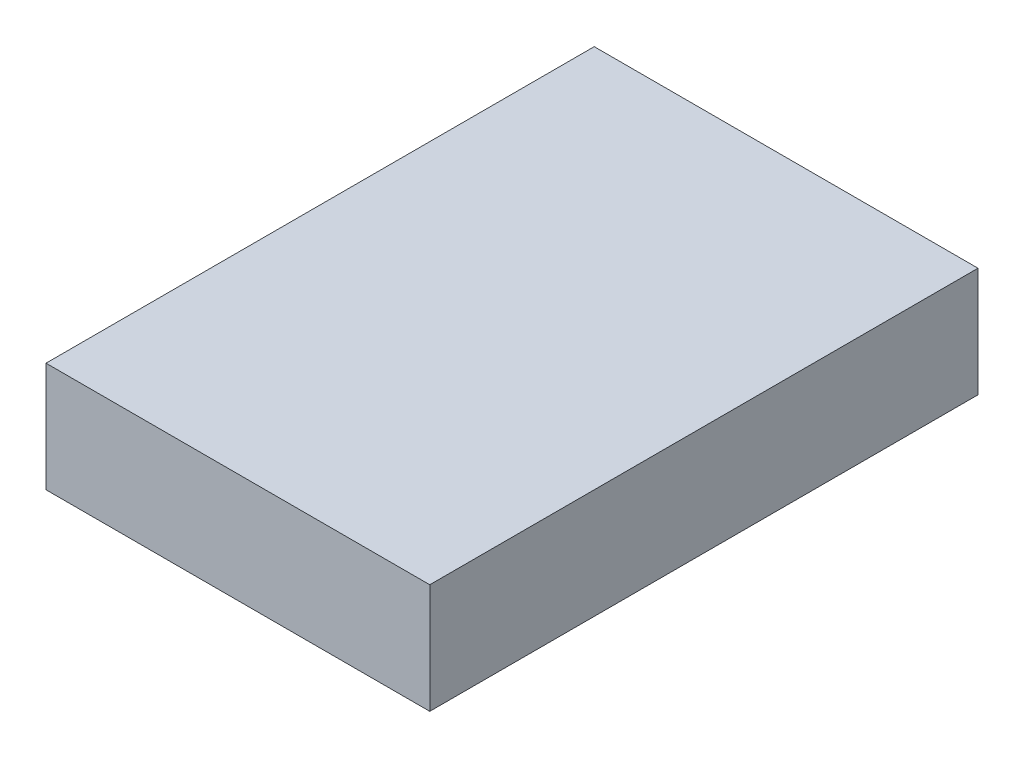
ISO-10303-21;
HEADER;
FILE_DESCRIPTION(('STEP AP214'),'2;1');
FILE_NAME('part.step','',(''),(''),'','','');
FILE_SCHEMA(('AUTOMOTIVE_DESIGN { 1 0 10303 214 1 1 1 1 }'));
ENDSEC;
DATA;
#1=APPLICATION_CONTEXT('core data for automotive mechanical design processes');
#2=APPLICATION_PROTOCOL_DEFINITION('international standard','automotive_design',2000,#1);
#3=PRODUCT_CONTEXT('',#1,'mechanical');
#4=PRODUCT('Part','Part','',(#3));
#5=PRODUCT_RELATED_PRODUCT_CATEGORY('part','',(#4));
#6=PRODUCT_DEFINITION_FORMATION('','',#4);
#7=PRODUCT_DEFINITION_CONTEXT('part definition',#1,'design');
#8=PRODUCT_DEFINITION('design','',#6,#7);
#9=PRODUCT_DEFINITION_SHAPE('','',#8);
#10=(LENGTH_UNIT() NAMED_UNIT(*) SI_UNIT(.MILLI.,.METRE.));
#11=(NAMED_UNIT(*) PLANE_ANGLE_UNIT() SI_UNIT($,.RADIAN.));
#12=(NAMED_UNIT(*) SI_UNIT($,.STERADIAN.) SOLID_ANGLE_UNIT());
#13=UNCERTAINTY_MEASURE_WITH_UNIT(LENGTH_MEASURE(1.E-05),#10,'distance_accuracy_value','');
#14=(GEOMETRIC_REPRESENTATION_CONTEXT(3) GLOBAL_UNCERTAINTY_ASSIGNED_CONTEXT((#13)) GLOBAL_UNIT_ASSIGNED_CONTEXT((#10,
#11,#12)) REPRESENTATION_CONTEXT('',''));
#15=CARTESIAN_POINT('',(0.,0.,0.));
#16=DIRECTION('',(0.,0.,1.));
#17=DIRECTION('',(1.,0.,0.));
#18=AXIS2_PLACEMENT_3D('',#15,#16,#17);
#19=CARTESIAN_POINT('',(0.,2.,0.));
#20=DIRECTION('',(1.,0.,0.));
#21=DIRECTION('',(0.,0.,-1.));
#22=AXIS2_PLACEMENT_3D('',#19,#20,#21);
#23=PLANE('',#22);
#24=DIRECTION('',(0.,0.,1.));
#25=VECTOR('',#24,1.);
#26=CARTESIAN_POINT('',(0.,0.,0.));
#27=LINE('',#26,#25);
#28=CARTESIAN_POINT('',(0.,0.,-10.));
#29=VERTEX_POINT('',#28);
#30=CARTESIAN_POINT('',(0.,0.,0.));
#31=VERTEX_POINT('',#30);
#32=EDGE_CURVE('E107',#29,#31,#27,.T.);
#33=ORIENTED_EDGE('',*,*,#32,.T.);
#34=DIRECTION('',(0.,-1.,0.));
#35=VECTOR('',#34,1.);
#36=CARTESIAN_POINT('',(0.,2.,0.));
#37=LINE('',#36,#35);
#38=CARTESIAN_POINT('',(0.,2.,0.));
#39=VERTEX_POINT('',#38);
#40=EDGE_CURVE('E11',#39,#31,#37,.T.);
#41=ORIENTED_EDGE('',*,*,#40,.F.);
#42=DIRECTION('',(0.,0.,1.));
#43=VECTOR('',#42,1.);
#44=CARTESIAN_POINT('',(0.,2.,0.));
#45=LINE('',#44,#43);
#46=CARTESIAN_POINT('',(0.,2.,-10.));
#47=VERTEX_POINT('',#46);
#48=EDGE_CURVE('E91',#47,#39,#45,.T.);
#49=ORIENTED_EDGE('',*,*,#48,.F.);
#50=DIRECTION('',(0.,-1.,0.));
#51=VECTOR('',#50,1.);
#52=CARTESIAN_POINT('',(0.,2.,-10.));
#53=LINE('',#52,#51);
#54=EDGE_CURVE('E103',#47,#29,#53,.T.);
#55=ORIENTED_EDGE('',*,*,#54,.T.);
#56=EDGE_LOOP('',(#33,#41,#49,#55));
#57=FACE_BOUND('',#56,.T.);
#58=ADVANCED_FACE('F39',(#57),#23,.F.);
#59=CARTESIAN_POINT('',(0.,2.,0.));
#60=DIRECTION('',(0.,0.,-1.));
#61=DIRECTION('',(-1.,0.,0.));
#62=AXIS2_PLACEMENT_3D('',#59,#60,#61);
#63=PLANE('',#62);
#64=DIRECTION('',(1.,0.,0.));
#65=VECTOR('',#64,1.);
#66=CARTESIAN_POINT('',(0.,0.,0.));
#67=LINE('',#66,#65);
#68=CARTESIAN_POINT('',(7.,0.,0.));
#69=VERTEX_POINT('',#68);
#70=EDGE_CURVE('E96',#31,#69,#67,.T.);
#71=ORIENTED_EDGE('',*,*,#70,.T.);
#72=DIRECTION('',(0.,-1.,0.));
#73=VECTOR('',#72,1.);
#74=CARTESIAN_POINT('',(7.,2.,0.));
#75=LINE('',#74,#73);
#76=CARTESIAN_POINT('',(7.,2.,0.));
#77=VERTEX_POINT('',#76);
#78=EDGE_CURVE('E48',#77,#69,#75,.T.);
#79=ORIENTED_EDGE('',*,*,#78,.F.);
#80=DIRECTION('',(1.,0.,0.));
#81=VECTOR('',#80,1.);
#82=CARTESIAN_POINT('',(0.,2.,0.));
#83=LINE('',#82,#81);
#84=EDGE_CURVE('E86',#39,#77,#83,.T.);
#85=ORIENTED_EDGE('',*,*,#84,.F.);
#86=ORIENTED_EDGE('',*,*,#40,.T.);
#87=EDGE_LOOP('',(#71,#79,#85,#86));
#88=FACE_BOUND('',#87,.T.);
#89=ADVANCED_FACE('F95',(#88),#63,.F.);
#90=CARTESIAN_POINT('',(7.,2.,0.));
#91=DIRECTION('',(-1.,0.,0.));
#92=DIRECTION('',(0.,0.,1.));
#93=AXIS2_PLACEMENT_3D('',#90,#91,#92);
#94=PLANE('',#93);
#95=DIRECTION('',(0.,0.,-1.));
#96=VECTOR('',#95,1.);
#97=CARTESIAN_POINT('',(7.,0.,0.));
#98=LINE('',#97,#96);
#99=CARTESIAN_POINT('',(7.,0.,-10.));
#100=VERTEX_POINT('',#99);
#101=EDGE_CURVE('E73',#69,#100,#98,.T.);
#102=ORIENTED_EDGE('',*,*,#101,.T.);
#103=DIRECTION('',(0.,-1.,0.));
#104=VECTOR('',#103,1.);
#105=CARTESIAN_POINT('',(7.,2.,-10.));
#106=LINE('',#105,#104);
#107=CARTESIAN_POINT('',(7.,2.,-10.));
#108=VERTEX_POINT('',#107);
#109=EDGE_CURVE('E98',#108,#100,#106,.T.);
#110=ORIENTED_EDGE('',*,*,#109,.F.);
#111=DIRECTION('',(0.,0.,-1.));
#112=VECTOR('',#111,1.);
#113=CARTESIAN_POINT('',(7.,2.,0.));
#114=LINE('',#113,#112);
#115=EDGE_CURVE('E89',#77,#108,#114,.T.);
#116=ORIENTED_EDGE('',*,*,#115,.F.);
#117=ORIENTED_EDGE('',*,*,#78,.T.);
#118=EDGE_LOOP('',(#102,#110,#116,#117));
#119=FACE_BOUND('',#118,.T.);
#120=ADVANCED_FACE('F99',(#119),#94,.F.);
#121=CARTESIAN_POINT('',(0.,2.,-10.));
#122=DIRECTION('',(0.,0.,1.));
#123=DIRECTION('',(1.,0.,0.));
#124=AXIS2_PLACEMENT_3D('',#121,#122,#123);
#125=PLANE('',#124);
#126=DIRECTION('',(-1.,0.,0.));
#127=VECTOR('',#126,1.);
#128=CARTESIAN_POINT('',(0.,0.,-10.));
#129=LINE('',#128,#127);
#130=EDGE_CURVE('E79',#100,#29,#129,.T.);
#131=ORIENTED_EDGE('',*,*,#130,.T.);
#132=ORIENTED_EDGE('',*,*,#54,.F.);
#133=DIRECTION('',(-1.,0.,0.));
#134=VECTOR('',#133,1.);
#135=CARTESIAN_POINT('',(0.,2.,-10.));
#136=LINE('',#135,#134);
#137=EDGE_CURVE('E56',#108,#47,#136,.T.);
#138=ORIENTED_EDGE('',*,*,#137,.F.);
#139=ORIENTED_EDGE('',*,*,#109,.T.);
#140=EDGE_LOOP('',(#131,#132,#138,#139));
#141=FACE_BOUND('',#140,.T.);
#142=ADVANCED_FACE('F120',(#141),#125,.F.);
#143=CARTESIAN_POINT('',(0.,2.,0.));
#144=DIRECTION('',(0.,-1.,0.));
#145=DIRECTION('',(0.,0.,-1.));
#146=AXIS2_PLACEMENT_3D('',#143,#144,#145);
#147=PLANE('',#146);
#148=ORIENTED_EDGE('',*,*,#48,.T.);
#149=ORIENTED_EDGE('',*,*,#84,.T.);
#150=ORIENTED_EDGE('',*,*,#115,.T.);
#151=ORIENTED_EDGE('',*,*,#137,.T.);
#152=EDGE_LOOP('',(#148,#149,#150,#151));
#153=FACE_BOUND('',#152,.T.);
#154=ADVANCED_FACE('F87',(#153),#147,.F.);
#155=CARTESIAN_POINT('',(0.,0.,0.));
#156=DIRECTION('',(0.,-1.,0.));
#157=DIRECTION('',(0.,0.,-1.));
#158=AXIS2_PLACEMENT_3D('',#155,#156,#157);
#159=PLANE('',#158);
#160=ORIENTED_EDGE('',*,*,#32,.F.);
#161=ORIENTED_EDGE('',*,*,#130,.F.);
#162=ORIENTED_EDGE('',*,*,#101,.F.);
#163=ORIENTED_EDGE('',*,*,#70,.F.);
#164=EDGE_LOOP('',(#160,#161,#162,#163));
#165=FACE_BOUND('',#164,.T.);
#166=ADVANCED_FACE('F123',(#165),#159,.T.);
#167=CLOSED_SHELL('',(#58,#89,#120,#142,#154,#166));
#168=MANIFOLD_SOLID_BREP('B2',#167);
#169=ADVANCED_BREP_SHAPE_REPRESENTATION('',(#18,#168),#14);
#170=SHAPE_DEFINITION_REPRESENTATION(#9,#169);
ENDSEC;
END-ISO-10303-21;
